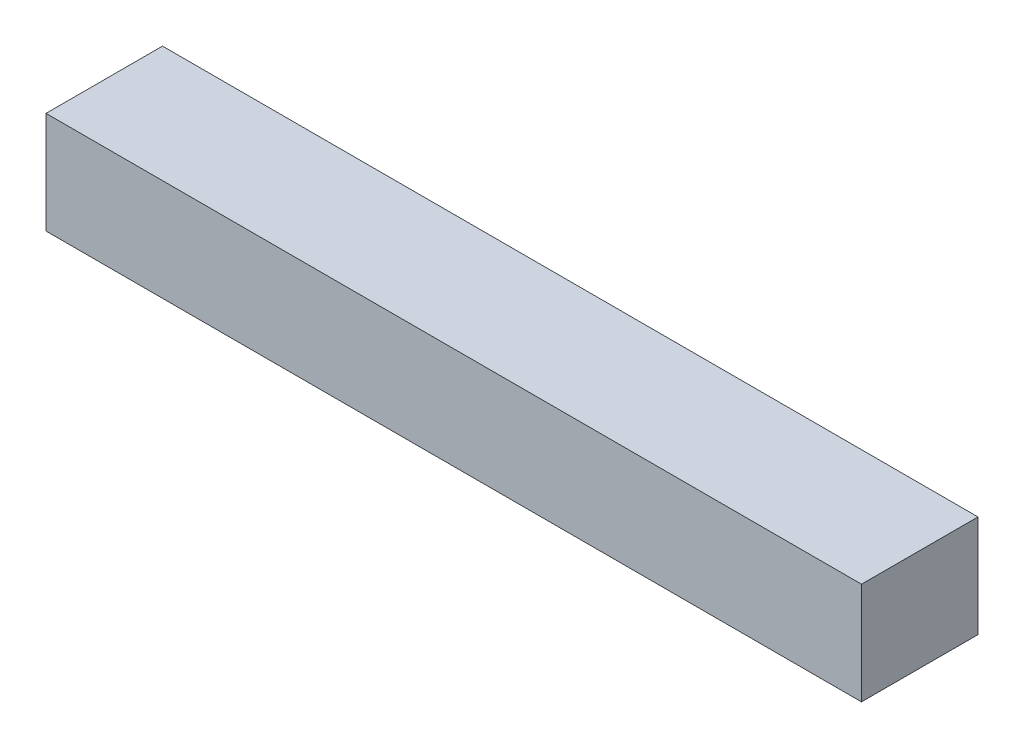
ISO-10303-21;
HEADER;
FILE_DESCRIPTION(('STEP AP214'),'2;1');
FILE_NAME('part.step','',(''),(''),'','','');
FILE_SCHEMA(('AUTOMOTIVE_DESIGN { 1 0 10303 214 1 1 1 1 }'));
ENDSEC;
DATA;
#1=APPLICATION_CONTEXT('core data for automotive mechanical design processes');
#2=APPLICATION_PROTOCOL_DEFINITION('international standard','automotive_design',2000,#1);
#3=PRODUCT_CONTEXT('',#1,'mechanical');
#4=PRODUCT('Part','Part','',(#3));
#5=PRODUCT_RELATED_PRODUCT_CATEGORY('part','',(#4));
#6=PRODUCT_DEFINITION_FORMATION('','',#4);
#7=PRODUCT_DEFINITION_CONTEXT('part definition',#1,'design');
#8=PRODUCT_DEFINITION('design','',#6,#7);
#9=PRODUCT_DEFINITION_SHAPE('','',#8);
#10=(LENGTH_UNIT() NAMED_UNIT(*) SI_UNIT(.MILLI.,.METRE.));
#11=(NAMED_UNIT(*) PLANE_ANGLE_UNIT() SI_UNIT($,.RADIAN.));
#12=(NAMED_UNIT(*) SI_UNIT($,.STERADIAN.) SOLID_ANGLE_UNIT());
#13=UNCERTAINTY_MEASURE_WITH_UNIT(LENGTH_MEASURE(1.E-05),#10,'distance_accuracy_value','');
#14=(GEOMETRIC_REPRESENTATION_CONTEXT(3) GLOBAL_UNCERTAINTY_ASSIGNED_CONTEXT((#13)) GLOBAL_UNIT_ASSIGNED_CONTEXT((#10,
#11,#12)) REPRESENTATION_CONTEXT('',''));
#15=CARTESIAN_POINT('',(0.,0.,0.));
#16=DIRECTION('',(0.,0.,1.));
#17=DIRECTION('',(1.,0.,0.));
#18=AXIS2_PLACEMENT_3D('',#15,#16,#17);
#19=CARTESIAN_POINT('',(56.,-4.04964005372387,7.67039862164474));
#20=DIRECTION('',(0.,0.,1.));
#21=DIRECTION('',(0.,-1.,0.));
#22=AXIS2_PLACEMENT_3D('',#19,#20,#21);
#23=PLANE('',#22);
#24=DIRECTION('',(0.,1.,0.));
#25=VECTOR('',#24,1.);
#26=CARTESIAN_POINT('',(0.,-4.04964005372387,7.67039862164474));
#27=LINE('',#26,#25);
#28=CARTESIAN_POINT('',(0.,-11.0496400537239,7.67039862164473));
#29=VERTEX_POINT('',#28);
#30=CARTESIAN_POINT('',(0.,-4.04964005372387,7.67039862164474));
#31=VERTEX_POINT('',#30);
#32=EDGE_CURVE('E95',#29,#31,#27,.T.);
#33=ORIENTED_EDGE('',*,*,#32,.T.);
#34=DIRECTION('',(-1.,0.,0.));
#35=VECTOR('',#34,1.);
#36=CARTESIAN_POINT('',(56.,-4.04964005372387,7.67039862164474));
#37=LINE('',#36,#35);
#38=CARTESIAN_POINT('',(56.,-4.04964005372387,7.67039862164474));
#39=VERTEX_POINT('',#38);
#40=EDGE_CURVE('E11',#39,#31,#37,.T.);
#41=ORIENTED_EDGE('',*,*,#40,.F.);
#42=DIRECTION('',(0.,1.,0.));
#43=VECTOR('',#42,1.);
#44=CARTESIAN_POINT('',(56.,-4.04964005372387,7.67039862164474));
#45=LINE('',#44,#43);
#46=CARTESIAN_POINT('',(56.,-11.0496400537239,7.67039862164473));
#47=VERTEX_POINT('',#46);
#48=EDGE_CURVE('E83',#47,#39,#45,.T.);
#49=ORIENTED_EDGE('',*,*,#48,.F.);
#50=DIRECTION('',(-1.,0.,0.));
#51=VECTOR('',#50,1.);
#52=CARTESIAN_POINT('',(56.,-11.0496400537239,7.67039862164473));
#53=LINE('',#52,#51);
#54=EDGE_CURVE('E91',#47,#29,#53,.T.);
#55=ORIENTED_EDGE('',*,*,#54,.T.);
#56=EDGE_LOOP('',(#33,#41,#49,#55));
#57=FACE_BOUND('',#56,.T.);
#58=ADVANCED_FACE('F32',(#57),#23,.F.);
#59=CARTESIAN_POINT('',(56.,-4.04964005372387,7.67039862164474));
#60=DIRECTION('',(0.,-1.,0.));
#61=DIRECTION('',(0.,0.,-1.));
#62=AXIS2_PLACEMENT_3D('',#59,#60,#61);
#63=PLANE('',#62);
#64=DIRECTION('',(0.,0.,1.));
#65=VECTOR('',#64,1.);
#66=CARTESIAN_POINT('',(0.,-4.04964005372387,7.67039862164474));
#67=LINE('',#66,#65);
#68=CARTESIAN_POINT('',(0.,-4.04964005372387,15.6703986216447));
#69=VERTEX_POINT('',#68);
#70=EDGE_CURVE('E87',#31,#69,#67,.T.);
#71=ORIENTED_EDGE('',*,*,#70,.T.);
#72=DIRECTION('',(-1.,0.,0.));
#73=VECTOR('',#72,1.);
#74=CARTESIAN_POINT('',(56.,-4.04964005372387,15.6703986216447));
#75=LINE('',#74,#73);
#76=CARTESIAN_POINT('',(56.,-4.04964005372387,15.6703986216447));
#77=VERTEX_POINT('',#76);
#78=EDGE_CURVE('E40',#77,#69,#75,.T.);
#79=ORIENTED_EDGE('',*,*,#78,.F.);
#80=DIRECTION('',(0.,0.,1.));
#81=VECTOR('',#80,1.);
#82=CARTESIAN_POINT('',(56.,-4.04964005372387,7.67039862164474));
#83=LINE('',#82,#81);
#84=EDGE_CURVE('E78',#39,#77,#83,.T.);
#85=ORIENTED_EDGE('',*,*,#84,.F.);
#86=ORIENTED_EDGE('',*,*,#40,.T.);
#87=EDGE_LOOP('',(#71,#79,#85,#86));
#88=FACE_BOUND('',#87,.T.);
#89=ADVANCED_FACE('F86',(#88),#63,.F.);
#90=CARTESIAN_POINT('',(56.,-4.04964005372387,15.6703986216447));
#91=DIRECTION('',(0.,0.,-1.));
#92=DIRECTION('',(-1.,0.,0.));
#93=AXIS2_PLACEMENT_3D('',#90,#91,#92);
#94=PLANE('',#93);
#95=DIRECTION('',(0.,-1.,0.));
#96=VECTOR('',#95,1.);
#97=CARTESIAN_POINT('',(0.,-4.04964005372387,15.6703986216447));
#98=LINE('',#97,#96);
#99=CARTESIAN_POINT('',(0.,-11.0496400537239,15.6703986216447));
#100=VERTEX_POINT('',#99);
#101=EDGE_CURVE('E65',#69,#100,#98,.T.);
#102=ORIENTED_EDGE('',*,*,#101,.T.);
#103=DIRECTION('',(-1.,0.,0.));
#104=VECTOR('',#103,1.);
#105=CARTESIAN_POINT('',(56.,-11.0496400537239,15.6703986216447));
#106=LINE('',#105,#104);
#107=CARTESIAN_POINT('',(56.,-11.0496400537239,15.6703986216447));
#108=VERTEX_POINT('',#107);
#109=EDGE_CURVE('E88',#108,#100,#106,.T.);
#110=ORIENTED_EDGE('',*,*,#109,.F.);
#111=DIRECTION('',(0.,-1.,0.));
#112=VECTOR('',#111,1.);
#113=CARTESIAN_POINT('',(56.,-4.04964005372387,15.6703986216447));
#114=LINE('',#113,#112);
#115=EDGE_CURVE('E81',#77,#108,#114,.T.);
#116=ORIENTED_EDGE('',*,*,#115,.F.);
#117=ORIENTED_EDGE('',*,*,#78,.T.);
#118=EDGE_LOOP('',(#102,#110,#116,#117));
#119=FACE_BOUND('',#118,.T.);
#120=ADVANCED_FACE('F89',(#119),#94,.F.);
#121=CARTESIAN_POINT('',(56.,-11.0496400537239,7.67039862164473));
#122=DIRECTION('',(0.,1.,0.));
#123=DIRECTION('',(0.,0.,1.));
#124=AXIS2_PLACEMENT_3D('',#121,#122,#123);
#125=PLANE('',#124);
#126=DIRECTION('',(0.,0.,-1.));
#127=VECTOR('',#126,1.);
#128=CARTESIAN_POINT('',(0.,-11.0496400537239,7.67039862164473));
#129=LINE('',#128,#127);
#130=EDGE_CURVE('E71',#100,#29,#129,.T.);
#131=ORIENTED_EDGE('',*,*,#130,.T.);
#132=ORIENTED_EDGE('',*,*,#54,.F.);
#133=DIRECTION('',(0.,0.,-1.));
#134=VECTOR('',#133,1.);
#135=CARTESIAN_POINT('',(56.,-11.0496400537239,7.67039862164473));
#136=LINE('',#135,#134);
#137=EDGE_CURVE('E48',#108,#47,#136,.T.);
#138=ORIENTED_EDGE('',*,*,#137,.F.);
#139=ORIENTED_EDGE('',*,*,#109,.T.);
#140=EDGE_LOOP('',(#131,#132,#138,#139));
#141=FACE_BOUND('',#140,.T.);
#142=ADVANCED_FACE('F102',(#141),#125,.F.);
#143=CARTESIAN_POINT('',(56.,0.,0.));
#144=DIRECTION('',(-1.,0.,0.));
#145=DIRECTION('',(0.,0.,1.));
#146=AXIS2_PLACEMENT_3D('',#143,#144,#145);
#147=PLANE('',#146);
#148=ORIENTED_EDGE('',*,*,#48,.T.);
#149=ORIENTED_EDGE('',*,*,#84,.T.);
#150=ORIENTED_EDGE('',*,*,#115,.T.);
#151=ORIENTED_EDGE('',*,*,#137,.T.);
#152=EDGE_LOOP('',(#148,#149,#150,#151));
#153=FACE_BOUND('',#152,.T.);
#154=ADVANCED_FACE('F79',(#153),#147,.F.);
#155=CARTESIAN_POINT('',(0.,0.,0.));
#156=DIRECTION('',(-1.,0.,0.));
#157=DIRECTION('',(0.,0.,1.));
#158=AXIS2_PLACEMENT_3D('',#155,#156,#157);
#159=PLANE('',#158);
#160=ORIENTED_EDGE('',*,*,#32,.F.);
#161=ORIENTED_EDGE('',*,*,#130,.F.);
#162=ORIENTED_EDGE('',*,*,#101,.F.);
#163=ORIENTED_EDGE('',*,*,#70,.F.);
#164=EDGE_LOOP('',(#160,#161,#162,#163));
#165=FACE_BOUND('',#164,.T.);
#166=ADVANCED_FACE('F105',(#165),#159,.T.);
#167=CLOSED_SHELL('',(#58,#89,#120,#142,#154,#166));
#168=MANIFOLD_SOLID_BREP('B2',#167);
#169=ADVANCED_BREP_SHAPE_REPRESENTATION('',(#18,#168),#14);
#170=SHAPE_DEFINITION_REPRESENTATION(#9,#169);
ENDSEC;
END-ISO-10303-21;
